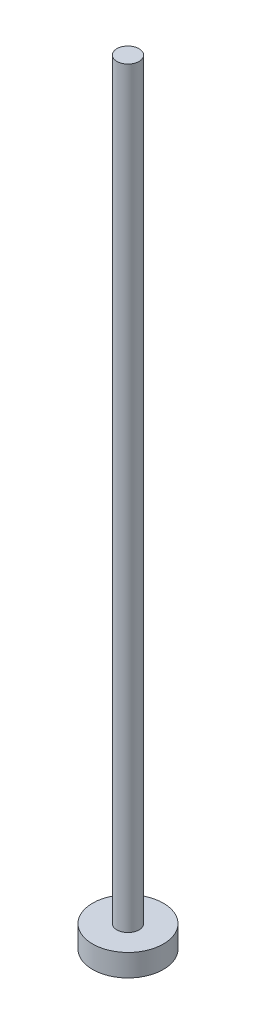
ISO-10303-21;
HEADER;
FILE_DESCRIPTION(('STEP AP214'),'2;1');
FILE_NAME('part.step','',(''),(''),'','','');
FILE_SCHEMA(('AUTOMOTIVE_DESIGN { 1 0 10303 214 1 1 1 1 }'));
ENDSEC;
DATA;
#1=APPLICATION_CONTEXT('core data for automotive mechanical design processes');
#2=APPLICATION_PROTOCOL_DEFINITION('international standard','automotive_design',2000,#1);
#3=PRODUCT_CONTEXT('',#1,'mechanical');
#4=PRODUCT('Part','Part','',(#3));
#5=PRODUCT_RELATED_PRODUCT_CATEGORY('part','',(#4));
#6=PRODUCT_DEFINITION_FORMATION('','',#4);
#7=PRODUCT_DEFINITION_CONTEXT('part definition',#1,'design');
#8=PRODUCT_DEFINITION('design','',#6,#7);
#9=PRODUCT_DEFINITION_SHAPE('','',#8);
#10=(LENGTH_UNIT() NAMED_UNIT(*) SI_UNIT(.MILLI.,.METRE.));
#11=(NAMED_UNIT(*) PLANE_ANGLE_UNIT() SI_UNIT($,.RADIAN.));
#12=(NAMED_UNIT(*) SI_UNIT($,.STERADIAN.) SOLID_ANGLE_UNIT());
#13=UNCERTAINTY_MEASURE_WITH_UNIT(LENGTH_MEASURE(1.E-05),#10,'distance_accuracy_value','');
#14=(GEOMETRIC_REPRESENTATION_CONTEXT(3) GLOBAL_UNCERTAINTY_ASSIGNED_CONTEXT((#13)) GLOBAL_UNIT_ASSIGNED_CONTEXT((#10,
#11,#12)) REPRESENTATION_CONTEXT('',''));
#15=CARTESIAN_POINT('',(0.,0.,0.));
#16=DIRECTION('',(0.,0.,1.));
#17=DIRECTION('',(1.,0.,0.));
#18=AXIS2_PLACEMENT_3D('',#15,#16,#17);
#19=CARTESIAN_POINT('',(2.5,175.,0.));
#20=DIRECTION('',(0.,-1.,0.));
#21=DIRECTION('',(1.,0.,0.));
#22=AXIS2_PLACEMENT_3D('',#19,#20,#21);
#23=PLANE('',#22);
#24=CARTESIAN_POINT('',(0.,175.,0.));
#25=DIRECTION('',(0.,1.,0.));
#26=DIRECTION('',(-1.,0.,0.));
#27=AXIS2_PLACEMENT_3D('',#24,#25,#26);
#28=CIRCLE('',#27,2.50000000000001);
#29=CARTESIAN_POINT('',(-2.50000000000002,175.,0.));
#30=VERTEX_POINT('',#29);
#31=EDGE_CURVE('E45',#30,#30,#28,.T.);
#32=ORIENTED_EDGE('',*,*,#31,.T.);
#33=EDGE_LOOP('',(#32));
#34=FACE_BOUND('',#33,.T.);
#35=ADVANCED_FACE('F31',(#34),#23,.F.);
#36=CARTESIAN_POINT('',(0.,0.,0.));
#37=DIRECTION('',(0.,1.,0.));
#38=DIRECTION('',(-1.,0.,0.));
#39=AXIS2_PLACEMENT_3D('',#36,#37,#38);
#40=PLANE('',#39);
#41=CARTESIAN_POINT('',(0.,0.,0.));
#42=DIRECTION('',(0.,1.,0.));
#43=DIRECTION('',(-1.,0.,0.));
#44=AXIS2_PLACEMENT_3D('',#41,#42,#43);
#45=CIRCLE('',#44,8.);
#46=CARTESIAN_POINT('',(-8.,0.,0.));
#47=VERTEX_POINT('',#46);
#48=EDGE_CURVE('E10',#47,#47,#45,.T.);
#49=ORIENTED_EDGE('',*,*,#48,.F.);
#50=EDGE_LOOP('',(#49));
#51=FACE_BOUND('',#50,.T.);
#52=ADVANCED_FACE('F65',(#51),#40,.F.);
#53=CARTESIAN_POINT('',(0.,175.,0.));
#54=DIRECTION('',(0.,1.,0.));
#55=DIRECTION('',(-1.,0.,0.));
#56=AXIS2_PLACEMENT_3D('',#53,#54,#55);
#57=CYLINDRICAL_SURFACE('',#56,8.);
#58=CARTESIAN_POINT('',(0.,5.,0.));
#59=DIRECTION('',(0.,1.,0.));
#60=DIRECTION('',(-1.,0.,0.));
#61=AXIS2_PLACEMENT_3D('',#58,#59,#60);
#62=CIRCLE('',#61,8.);
#63=CARTESIAN_POINT('',(-8.,5.,0.));
#64=VERTEX_POINT('',#63);
#65=EDGE_CURVE('E37',#64,#64,#62,.T.);
#66=ORIENTED_EDGE('',*,*,#65,.F.);
#67=EDGE_LOOP('',(#66));
#68=FACE_BOUND('',#67,.T.);
#69=ORIENTED_EDGE('',*,*,#48,.T.);
#70=EDGE_LOOP('',(#69));
#71=FACE_BOUND('',#70,.T.);
#72=ADVANCED_FACE('F60',(#68,#71),#57,.T.);
#73=CARTESIAN_POINT('',(8.,5.,0.));
#74=DIRECTION('',(0.,-1.,0.));
#75=DIRECTION('',(1.,0.,0.));
#76=AXIS2_PLACEMENT_3D('',#73,#74,#75);
#77=PLANE('',#76);
#78=CARTESIAN_POINT('',(0.,5.,0.));
#79=DIRECTION('',(0.,1.,0.));
#80=DIRECTION('',(-1.,0.,0.));
#81=AXIS2_PLACEMENT_3D('',#78,#79,#80);
#82=CIRCLE('',#81,2.5);
#83=CARTESIAN_POINT('',(-2.5,5.,0.));
#84=VERTEX_POINT('',#83);
#85=EDGE_CURVE('E41',#84,#84,#82,.T.);
#86=ORIENTED_EDGE('',*,*,#85,.F.);
#87=EDGE_LOOP('',(#86));
#88=FACE_BOUND('',#87,.T.);
#89=ORIENTED_EDGE('',*,*,#65,.T.);
#90=EDGE_LOOP('',(#89));
#91=FACE_BOUND('',#90,.T.);
#92=ADVANCED_FACE('F55',(#88,#91),#77,.F.);
#93=CARTESIAN_POINT('',(0.,175.,0.));
#94=DIRECTION('',(0.,1.,0.));
#95=DIRECTION('',(-1.,0.,0.));
#96=AXIS2_PLACEMENT_3D('',#93,#94,#95);
#97=CYLINDRICAL_SURFACE('',#96,2.50000000000001);
#98=ORIENTED_EDGE('',*,*,#31,.F.);
#99=EDGE_LOOP('',(#98));
#100=FACE_BOUND('',#99,.T.);
#101=ORIENTED_EDGE('',*,*,#85,.T.);
#102=EDGE_LOOP('',(#101));
#103=FACE_BOUND('',#102,.T.);
#104=ADVANCED_FACE('F52',(#100,#103),#97,.T.);
#105=CLOSED_SHELL('',(#35,#52,#72,#92,#104));
#106=MANIFOLD_SOLID_BREP('B2',#105);
#107=ADVANCED_BREP_SHAPE_REPRESENTATION('',(#18,#106),#14);
#108=SHAPE_DEFINITION_REPRESENTATION(#9,#107);
ENDSEC;
END-ISO-10303-21;
